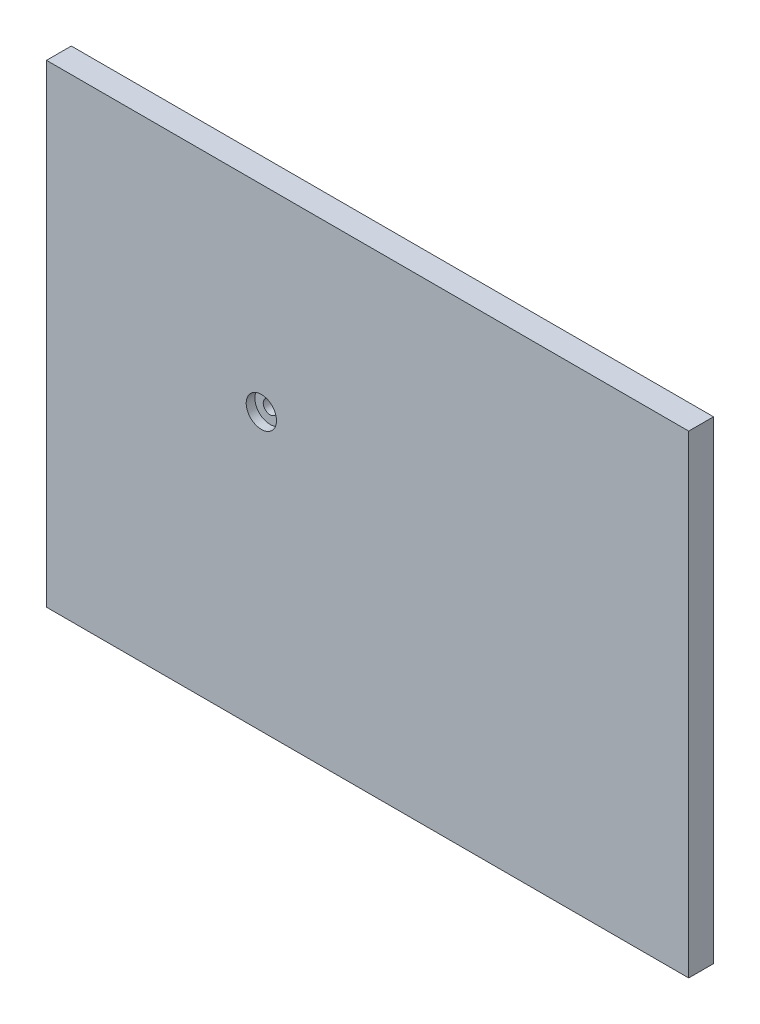
ISO-10303-21;
HEADER;
FILE_DESCRIPTION(('STEP AP214'),'2;1');
FILE_NAME('part.step','',(''),(''),'','','');
FILE_SCHEMA(('AUTOMOTIVE_DESIGN { 1 0 10303 214 1 1 1 1 }'));
ENDSEC;
DATA;
#1=APPLICATION_CONTEXT('core data for automotive mechanical design processes');
#2=APPLICATION_PROTOCOL_DEFINITION('international standard','automotive_design',2000,#1);
#3=PRODUCT_CONTEXT('',#1,'mechanical');
#4=PRODUCT('Part','Part','',(#3));
#5=PRODUCT_RELATED_PRODUCT_CATEGORY('part','',(#4));
#6=PRODUCT_DEFINITION_FORMATION('','',#4);
#7=PRODUCT_DEFINITION_CONTEXT('part definition',#1,'design');
#8=PRODUCT_DEFINITION('design','',#6,#7);
#9=PRODUCT_DEFINITION_SHAPE('','',#8);
#10=(LENGTH_UNIT() NAMED_UNIT(*) SI_UNIT(.MILLI.,.METRE.));
#11=(NAMED_UNIT(*) PLANE_ANGLE_UNIT() SI_UNIT($,.RADIAN.));
#12=(NAMED_UNIT(*) SI_UNIT($,.STERADIAN.) SOLID_ANGLE_UNIT());
#13=UNCERTAINTY_MEASURE_WITH_UNIT(LENGTH_MEASURE(1.E-05),#10,'distance_accuracy_value','');
#14=(GEOMETRIC_REPRESENTATION_CONTEXT(3) GLOBAL_UNCERTAINTY_ASSIGNED_CONTEXT((#13)) GLOBAL_UNIT_ASSIGNED_CONTEXT((#10,
#11,#12)) REPRESENTATION_CONTEXT('',''));
#15=CARTESIAN_POINT('',(0.,0.,0.));
#16=DIRECTION('',(0.,0.,1.));
#17=DIRECTION('',(1.,0.,0.));
#18=AXIS2_PLACEMENT_3D('',#15,#16,#17);
#19=CARTESIAN_POINT('',(129.545516373346,95.5450993158292,10.));
#20=DIRECTION('',(-1.,0.,0.));
#21=DIRECTION('',(0.,0.,1.));
#22=AXIS2_PLACEMENT_3D('',#19,#20,#21);
#23=PLANE('',#22);
#24=DIRECTION('',(0.,1.,0.));
#25=VECTOR('',#24,1.);
#26=CARTESIAN_POINT('',(129.545516373346,95.5450993158292,0.));
#27=LINE('',#26,#25);
#28=CARTESIAN_POINT('',(129.545516373346,-95.5450993158292,0.));
#29=VERTEX_POINT('',#28);
#30=CARTESIAN_POINT('',(129.545516373346,95.5450993158292,0.));
#31=VERTEX_POINT('',#30);
#32=EDGE_CURVE('E119',#29,#31,#27,.T.);
#33=ORIENTED_EDGE('',*,*,#32,.T.);
#34=DIRECTION('',(0.,0.,-1.));
#35=VECTOR('',#34,1.);
#36=CARTESIAN_POINT('',(129.545516373346,95.5450993158292,10.));
#37=LINE('',#36,#35);
#38=CARTESIAN_POINT('',(129.545516373346,95.5450993158292,10.));
#39=VERTEX_POINT('',#38);
#40=EDGE_CURVE('E11',#39,#31,#37,.T.);
#41=ORIENTED_EDGE('',*,*,#40,.F.);
#42=DIRECTION('',(0.,1.,0.));
#43=VECTOR('',#42,1.);
#44=CARTESIAN_POINT('',(129.545516373346,95.5450993158292,10.));
#45=LINE('',#44,#43);
#46=CARTESIAN_POINT('',(129.545516373346,-95.5450993158292,10.));
#47=VERTEX_POINT('',#46);
#48=EDGE_CURVE('E103',#47,#39,#45,.T.);
#49=ORIENTED_EDGE('',*,*,#48,.F.);
#50=DIRECTION('',(0.,0.,-1.));
#51=VECTOR('',#50,1.);
#52=CARTESIAN_POINT('',(129.545516373346,-95.5450993158292,10.));
#53=LINE('',#52,#51);
#54=EDGE_CURVE('E115',#47,#29,#53,.T.);
#55=ORIENTED_EDGE('',*,*,#54,.T.);
#56=EDGE_LOOP('',(#33,#41,#49,#55));
#57=FACE_BOUND('',#56,.T.);
#58=ADVANCED_FACE('F51',(#57),#23,.F.);
#59=CARTESIAN_POINT('',(-129.545516373346,95.5450993158292,10.));
#60=DIRECTION('',(0.,-1.,0.));
#61=DIRECTION('',(0.,0.,-1.));
#62=AXIS2_PLACEMENT_3D('',#59,#60,#61);
#63=PLANE('',#62);
#64=DIRECTION('',(-1.,0.,0.));
#65=VECTOR('',#64,1.);
#66=CARTESIAN_POINT('',(-129.545516373346,95.5450993158292,0.));
#67=LINE('',#66,#65);
#68=CARTESIAN_POINT('',(-129.545516373346,95.5450993158292,0.));
#69=VERTEX_POINT('',#68);
#70=EDGE_CURVE('E108',#31,#69,#67,.T.);
#71=ORIENTED_EDGE('',*,*,#70,.T.);
#72=DIRECTION('',(0.,0.,-1.));
#73=VECTOR('',#72,1.);
#74=CARTESIAN_POINT('',(-129.545516373346,95.5450993158292,10.));
#75=LINE('',#74,#73);
#76=CARTESIAN_POINT('',(-129.545516373346,95.5450993158292,10.));
#77=VERTEX_POINT('',#76);
#78=EDGE_CURVE('E60',#77,#69,#75,.T.);
#79=ORIENTED_EDGE('',*,*,#78,.F.);
#80=DIRECTION('',(-1.,0.,0.));
#81=VECTOR('',#80,1.);
#82=CARTESIAN_POINT('',(-129.545516373346,95.5450993158292,10.));
#83=LINE('',#82,#81);
#84=EDGE_CURVE('E98',#39,#77,#83,.T.);
#85=ORIENTED_EDGE('',*,*,#84,.F.);
#86=ORIENTED_EDGE('',*,*,#40,.T.);
#87=EDGE_LOOP('',(#71,#79,#85,#86));
#88=FACE_BOUND('',#87,.T.);
#89=ADVANCED_FACE('F107',(#88),#63,.F.);
#90=CARTESIAN_POINT('',(-129.545516373346,95.5450993158292,10.));
#91=DIRECTION('',(1.,0.,0.));
#92=DIRECTION('',(0.,0.,-1.));
#93=AXIS2_PLACEMENT_3D('',#90,#91,#92);
#94=PLANE('',#93);
#95=DIRECTION('',(0.,-1.,0.));
#96=VECTOR('',#95,1.);
#97=CARTESIAN_POINT('',(-129.545516373346,95.5450993158292,0.));
#98=LINE('',#97,#96);
#99=CARTESIAN_POINT('',(-129.545516373346,-95.5450993158292,0.));
#100=VERTEX_POINT('',#99);
#101=EDGE_CURVE('E85',#69,#100,#98,.T.);
#102=ORIENTED_EDGE('',*,*,#101,.T.);
#103=DIRECTION('',(0.,0.,-1.));
#104=VECTOR('',#103,1.);
#105=CARTESIAN_POINT('',(-129.545516373346,-95.5450993158292,10.));
#106=LINE('',#105,#104);
#107=CARTESIAN_POINT('',(-129.545516373346,-95.5450993158292,10.));
#108=VERTEX_POINT('',#107);
#109=EDGE_CURVE('E110',#108,#100,#106,.T.);
#110=ORIENTED_EDGE('',*,*,#109,.F.);
#111=DIRECTION('',(0.,-1.,0.));
#112=VECTOR('',#111,1.);
#113=CARTESIAN_POINT('',(-129.545516373346,95.5450993158292,10.));
#114=LINE('',#113,#112);
#115=EDGE_CURVE('E101',#77,#108,#114,.T.);
#116=ORIENTED_EDGE('',*,*,#115,.F.);
#117=ORIENTED_EDGE('',*,*,#78,.T.);
#118=EDGE_LOOP('',(#102,#110,#116,#117));
#119=FACE_BOUND('',#118,.T.);
#120=ADVANCED_FACE('F111',(#119),#94,.F.);
#121=CARTESIAN_POINT('',(-129.545516373346,-95.5450993158292,10.));
#122=DIRECTION('',(0.,1.,0.));
#123=DIRECTION('',(0.,0.,1.));
#124=AXIS2_PLACEMENT_3D('',#121,#122,#123);
#125=PLANE('',#124);
#126=DIRECTION('',(1.,0.,0.));
#127=VECTOR('',#126,1.);
#128=CARTESIAN_POINT('',(-129.545516373346,-95.5450993158292,0.));
#129=LINE('',#128,#127);
#130=EDGE_CURVE('E91',#100,#29,#129,.T.);
#131=ORIENTED_EDGE('',*,*,#130,.T.);
#132=ORIENTED_EDGE('',*,*,#54,.F.);
#133=DIRECTION('',(1.,0.,0.));
#134=VECTOR('',#133,1.);
#135=CARTESIAN_POINT('',(-129.545516373346,-95.5450993158292,10.));
#136=LINE('',#135,#134);
#137=EDGE_CURVE('E68',#108,#47,#136,.T.);
#138=ORIENTED_EDGE('',*,*,#137,.F.);
#139=ORIENTED_EDGE('',*,*,#109,.T.);
#140=EDGE_LOOP('',(#131,#132,#138,#139));
#141=FACE_BOUND('',#140,.T.);
#142=ADVANCED_FACE('F133',(#141),#125,.F.);
#143=CARTESIAN_POINT('',(0.,0.,10.));
#144=DIRECTION('',(0.,0.,1.));
#145=DIRECTION('',(1.,0.,0.));
#146=AXIS2_PLACEMENT_3D('',#143,#144,#145);
#147=PLANE('',#146);
#148=CARTESIAN_POINT('',(-42.8609540572501,16.0350392825948,10.));
#149=DIRECTION('',(0.,0.,1.));
#150=DIRECTION('',(1.,0.,0.));
#151=AXIS2_PLACEMENT_3D('',#148,#149,#150);
#152=CIRCLE('',#151,6.119);
#153=CARTESIAN_POINT('',(-36.7419540572501,16.0350392825948,10.));
#154=VERTEX_POINT('',#153);
#155=EDGE_CURVE('E151',#154,#154,#152,.T.);
#156=ORIENTED_EDGE('',*,*,#155,.F.);
#157=EDGE_LOOP('',(#156));
#158=FACE_BOUND('',#157,.T.);
#159=ORIENTED_EDGE('',*,*,#48,.T.);
#160=ORIENTED_EDGE('',*,*,#84,.T.);
#161=ORIENTED_EDGE('',*,*,#115,.T.);
#162=ORIENTED_EDGE('',*,*,#137,.T.);
#163=EDGE_LOOP('',(#159,#160,#161,#162));
#164=FACE_BOUND('',#163,.T.);
#165=ADVANCED_FACE('F99',(#158,#164),#147,.T.);
#166=CARTESIAN_POINT('',(0.,0.,0.));
#167=DIRECTION('',(0.,0.,1.));
#168=DIRECTION('',(1.,0.,0.));
#169=AXIS2_PLACEMENT_3D('',#166,#167,#168);
#170=PLANE('',#169);
#171=CARTESIAN_POINT('',(-42.8609540572501,16.0350392825948,0.));
#172=DIRECTION('',(0.,0.,1.));
#173=DIRECTION('',(1.,0.,0.));
#174=AXIS2_PLACEMENT_3D('',#171,#172,#173);
#175=CIRCLE('',#174,2.75);
#176=CARTESIAN_POINT('',(-40.1109540572501,16.0350392825948,0.));
#177=VERTEX_POINT('',#176);
#178=EDGE_CURVE('E123',#177,#177,#175,.T.);
#179=ORIENTED_EDGE('',*,*,#178,.T.);
#180=EDGE_LOOP('',(#179));
#181=FACE_BOUND('',#180,.T.);
#182=ORIENTED_EDGE('',*,*,#32,.F.);
#183=ORIENTED_EDGE('',*,*,#130,.F.);
#184=ORIENTED_EDGE('',*,*,#101,.F.);
#185=ORIENTED_EDGE('',*,*,#70,.F.);
#186=EDGE_LOOP('',(#182,#183,#184,#185));
#187=FACE_BOUND('',#186,.T.);
#188=ADVANCED_FACE('F136',(#181,#187),#170,.F.);
#189=CARTESIAN_POINT('',(-42.8609540572501,16.0350392825948,10.));
#190=DIRECTION('',(0.,0.,1.));
#191=DIRECTION('',(1.,0.,0.));
#192=AXIS2_PLACEMENT_3D('',#189,#190,#191);
#193=CYLINDRICAL_SURFACE('',#192,2.75);
#194=ORIENTED_EDGE('',*,*,#178,.F.);
#195=EDGE_LOOP('',(#194));
#196=FACE_BOUND('',#195,.T.);
#197=CARTESIAN_POINT('',(-42.8609540572501,16.0350392825948,6.5));
#198=DIRECTION('',(0.,0.,1.));
#199=DIRECTION('',(1.,0.,0.));
#200=AXIS2_PLACEMENT_3D('',#197,#198,#199);
#201=CIRCLE('',#200,2.75);
#202=CARTESIAN_POINT('',(-40.1109540572501,16.0350392825948,6.5));
#203=VERTEX_POINT('',#202);
#204=EDGE_CURVE('E143',#203,#203,#201,.T.);
#205=ORIENTED_EDGE('',*,*,#204,.T.);
#206=EDGE_LOOP('',(#205));
#207=FACE_BOUND('',#206,.T.);
#208=ADVANCED_FACE('F162',(#196,#207),#193,.F.);
#209=CARTESIAN_POINT('',(-40.1109540572501,16.0350392825948,6.5));
#210=DIRECTION('',(0.,0.,-1.));
#211=DIRECTION('',(-1.,0.,0.));
#212=AXIS2_PLACEMENT_3D('',#209,#210,#211);
#213=PLANE('',#212);
#214=ORIENTED_EDGE('',*,*,#204,.F.);
#215=EDGE_LOOP('',(#214));
#216=FACE_BOUND('',#215,.T.);
#217=CARTESIAN_POINT('',(-42.8609540572501,16.0350392825948,6.5));
#218=DIRECTION('',(0.,0.,1.));
#219=DIRECTION('',(1.,0.,0.));
#220=AXIS2_PLACEMENT_3D('',#217,#218,#219);
#221=CIRCLE('',#220,6.119);
#222=CARTESIAN_POINT('',(-36.7419540572501,16.0350392825948,6.5));
#223=VERTEX_POINT('',#222);
#224=EDGE_CURVE('E147',#223,#223,#221,.T.);
#225=ORIENTED_EDGE('',*,*,#224,.T.);
#226=EDGE_LOOP('',(#225));
#227=FACE_BOUND('',#226,.T.);
#228=ADVANCED_FACE('F203',(#216,#227),#213,.F.);
#229=CARTESIAN_POINT('',(-42.8609540572501,16.0350392825948,10.));
#230=DIRECTION('',(0.,0.,1.));
#231=DIRECTION('',(1.,0.,0.));
#232=AXIS2_PLACEMENT_3D('',#229,#230,#231);
#233=CYLINDRICAL_SURFACE('',#232,6.119);
#234=ORIENTED_EDGE('',*,*,#224,.F.);
#235=EDGE_LOOP('',(#234));
#236=FACE_BOUND('',#235,.T.);
#237=ORIENTED_EDGE('',*,*,#155,.T.);
#238=EDGE_LOOP('',(#237));
#239=FACE_BOUND('',#238,.T.);
#240=ADVANCED_FACE('F156',(#236,#239),#233,.F.);
#241=CLOSED_SHELL('',(#58,#89,#120,#142,#165,#188,#208,#228,#240));
#242=MANIFOLD_SOLID_BREP('B2',#241);
#243=ADVANCED_BREP_SHAPE_REPRESENTATION('',(#18,#242),#14);
#244=SHAPE_DEFINITION_REPRESENTATION(#9,#243);
ENDSEC;
END-ISO-10303-21;
